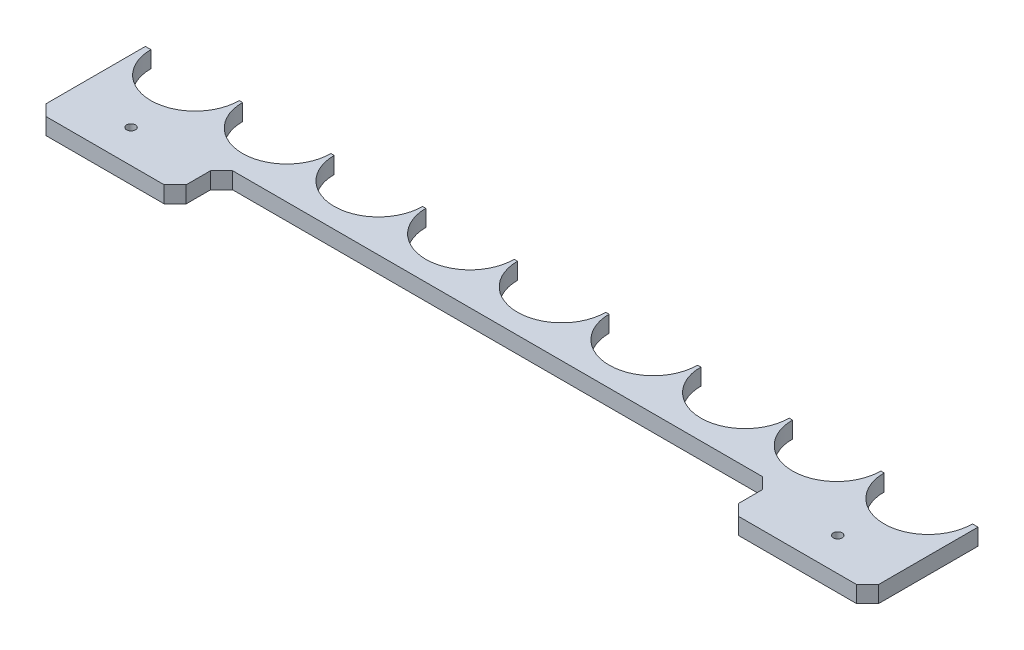
ISO-10303-21;
HEADER;
FILE_DESCRIPTION(('STEP AP214'),'2;1');
FILE_NAME('part.step','',(''),(''),'','','');
FILE_SCHEMA(('AUTOMOTIVE_DESIGN { 1 0 10303 214 1 1 1 1 }'));
ENDSEC;
DATA;
#1=APPLICATION_CONTEXT('core data for automotive mechanical design processes');
#2=APPLICATION_PROTOCOL_DEFINITION('international standard','automotive_design',2000,#1);
#3=PRODUCT_CONTEXT('',#1,'mechanical');
#4=PRODUCT('Part','Part','',(#3));
#5=PRODUCT_RELATED_PRODUCT_CATEGORY('part','',(#4));
#6=PRODUCT_DEFINITION_FORMATION('','',#4);
#7=PRODUCT_DEFINITION_CONTEXT('part definition',#1,'design');
#8=PRODUCT_DEFINITION('design','',#6,#7);
#9=PRODUCT_DEFINITION_SHAPE('','',#8);
#10=(LENGTH_UNIT() NAMED_UNIT(*) SI_UNIT(.MILLI.,.METRE.));
#11=(NAMED_UNIT(*) PLANE_ANGLE_UNIT() SI_UNIT($,.RADIAN.));
#12=(NAMED_UNIT(*) SI_UNIT($,.STERADIAN.) SOLID_ANGLE_UNIT());
#13=UNCERTAINTY_MEASURE_WITH_UNIT(LENGTH_MEASURE(1.E-05),#10,'distance_accuracy_value','');
#14=(GEOMETRIC_REPRESENTATION_CONTEXT(3) GLOBAL_UNCERTAINTY_ASSIGNED_CONTEXT((#13)) GLOBAL_UNIT_ASSIGNED_CONTEXT((#10,
#11,#12)) REPRESENTATION_CONTEXT('',''));
#15=CARTESIAN_POINT('',(0.,0.,0.));
#16=DIRECTION('',(0.,0.,1.));
#17=DIRECTION('',(1.,0.,0.));
#18=AXIS2_PLACEMENT_3D('',#15,#16,#17);
#19=CARTESIAN_POINT('',(-377.,-15.,50.));
#20=DIRECTION('',(0.,0.,1.));
#21=DIRECTION('',(1.,0.,0.));
#22=AXIS2_PLACEMENT_3D('',#19,#20,#21);
#23=PLANE('',#22);
#24=DIRECTION('',(1.,0.,0.));
#25=VECTOR('',#24,1.);
#26=CARTESIAN_POINT('',(-377.,-15.,50.));
#27=LINE('',#26,#25);
#28=CARTESIAN_POINT('',(-367.,-15.,50.));
#29=VERTEX_POINT('',#28);
#30=CARTESIAN_POINT('',(-260.,-15.,50.));
#31=VERTEX_POINT('',#30);
#32=EDGE_CURVE('E270',#29,#31,#27,.T.);
#33=ORIENTED_EDGE('',*,*,#32,.T.);
#34=DIRECTION('',(0.,1.,0.));
#35=VECTOR('',#34,1.);
#36=CARTESIAN_POINT('',(-260.,0.,50.));
#37=LINE('',#36,#35);
#38=CARTESIAN_POINT('',(-260.,0.,50.));
#39=VERTEX_POINT('',#38);
#40=EDGE_CURVE('E476',#31,#39,#37,.T.);
#41=ORIENTED_EDGE('',*,*,#40,.T.);
#42=DIRECTION('',(1.,0.,0.));
#43=VECTOR('',#42,1.);
#44=CARTESIAN_POINT('',(-377.,0.,50.));
#45=LINE('',#44,#43);
#46=CARTESIAN_POINT('',(-367.,0.,50.));
#47=VERTEX_POINT('',#46);
#48=EDGE_CURVE('E262',#47,#39,#45,.T.);
#49=ORIENTED_EDGE('',*,*,#48,.F.);
#50=DIRECTION('',(0.,-1.,0.));
#51=VECTOR('',#50,1.);
#52=CARTESIAN_POINT('',(-367.,-15.,50.));
#53=LINE('',#52,#51);
#54=EDGE_CURVE('E474',#47,#29,#53,.T.);
#55=ORIENTED_EDGE('',*,*,#54,.T.);
#56=EDGE_LOOP('',(#33,#41,#49,#55));
#57=FACE_BOUND('',#56,.T.);
#58=ADVANCED_FACE('F40',(#57),#23,.T.);
#59=CARTESIAN_POINT('',(377.,-15.,-50.));
#60=DIRECTION('',(1.,0.,0.));
#61=DIRECTION('',(0.,0.,-1.));
#62=AXIS2_PLACEMENT_3D('',#59,#60,#61);
#63=PLANE('',#62);
#64=DIRECTION('',(0.,0.,-1.));
#65=VECTOR('',#64,1.);
#66=CARTESIAN_POINT('',(377.,0.,-50.));
#67=LINE('',#66,#65);
#68=CARTESIAN_POINT('',(377.,0.,40.));
#69=VERTEX_POINT('',#68);
#70=CARTESIAN_POINT('',(377.,0.,-50.));
#71=VERTEX_POINT('',#70);
#72=EDGE_CURVE('E338',#69,#71,#67,.T.);
#73=ORIENTED_EDGE('',*,*,#72,.F.);
#74=DIRECTION('',(0.,-1.,0.));
#75=VECTOR('',#74,1.);
#76=CARTESIAN_POINT('',(377.,-15.,40.));
#77=LINE('',#76,#75);
#78=CARTESIAN_POINT('',(377.,-15.,40.));
#79=VERTEX_POINT('',#78);
#80=EDGE_CURVE('E258',#69,#79,#77,.T.);
#81=ORIENTED_EDGE('',*,*,#80,.T.);
#82=DIRECTION('',(0.,0.,-1.));
#83=VECTOR('',#82,1.);
#84=CARTESIAN_POINT('',(377.,-15.,-50.));
#85=LINE('',#84,#83);
#86=CARTESIAN_POINT('',(377.,-15.,-50.));
#87=VERTEX_POINT('',#86);
#88=EDGE_CURVE('E251',#79,#87,#85,.T.);
#89=ORIENTED_EDGE('',*,*,#88,.T.);
#90=DIRECTION('',(0.,1.,0.));
#91=VECTOR('',#90,1.);
#92=CARTESIAN_POINT('',(377.,-15.,-50.));
#93=LINE('',#92,#91);
#94=EDGE_CURVE('E255',#87,#71,#93,.T.);
#95=ORIENTED_EDGE('',*,*,#94,.T.);
#96=EDGE_LOOP('',(#73,#81,#89,#95));
#97=FACE_BOUND('',#96,.T.);
#98=ADVANCED_FACE('F254',(#97),#63,.T.);
#99=CARTESIAN_POINT('',(260.,-15.,50.));
#100=VERTEX_POINT('',#99);
#101=CARTESIAN_POINT('',(367.,-15.,50.));
#102=VERTEX_POINT('',#101);
#103=EDGE_CURVE('E335',#100,#102,#27,.T.);
#104=ORIENTED_EDGE('',*,*,#103,.T.);
#105=DIRECTION('',(0.,1.,0.));
#106=VECTOR('',#105,1.);
#107=CARTESIAN_POINT('',(367.,-15.,50.));
#108=LINE('',#107,#106);
#109=CARTESIAN_POINT('',(367.,0.,50.));
#110=VERTEX_POINT('',#109);
#111=EDGE_CURVE('E441',#102,#110,#108,.T.);
#112=ORIENTED_EDGE('',*,*,#111,.T.);
#113=CARTESIAN_POINT('',(260.,0.,50.));
#114=VERTEX_POINT('',#113);
#115=EDGE_CURVE('E399',#114,#110,#45,.T.);
#116=ORIENTED_EDGE('',*,*,#115,.F.);
#117=DIRECTION('',(0.,-1.,0.));
#118=VECTOR('',#117,1.);
#119=CARTESIAN_POINT('',(260.,-15.,50.));
#120=LINE('',#119,#118);
#121=EDGE_CURVE('E404',#114,#100,#120,.T.);
#122=ORIENTED_EDGE('',*,*,#121,.T.);
#123=EDGE_LOOP('',(#104,#112,#116,#122));
#124=FACE_BOUND('',#123,.T.);
#125=ADVANCED_FACE('F549',(#124),#23,.T.);
#126=CARTESIAN_POINT('',(-377.,-15.,-50.));
#127=DIRECTION('',(-1.,0.,0.));
#128=DIRECTION('',(0.,0.,1.));
#129=AXIS2_PLACEMENT_3D('',#126,#127,#128);
#130=PLANE('',#129);
#131=DIRECTION('',(0.,0.,1.));
#132=VECTOR('',#131,1.);
#133=CARTESIAN_POINT('',(-377.,-15.,-50.));
#134=LINE('',#133,#132);
#135=CARTESIAN_POINT('',(-377.,-15.,-50.));
#136=VERTEX_POINT('',#135);
#137=CARTESIAN_POINT('',(-377.,-15.,40.));
#138=VERTEX_POINT('',#137);
#139=EDGE_CURVE('E332',#136,#138,#134,.T.);
#140=ORIENTED_EDGE('',*,*,#139,.T.);
#141=DIRECTION('',(0.,1.,0.));
#142=VECTOR('',#141,1.);
#143=CARTESIAN_POINT('',(-377.,-15.,40.));
#144=LINE('',#143,#142);
#145=CARTESIAN_POINT('',(-377.,0.,40.));
#146=VERTEX_POINT('',#145);
#147=EDGE_CURVE('E479',#138,#146,#144,.T.);
#148=ORIENTED_EDGE('',*,*,#147,.T.);
#149=DIRECTION('',(0.,0.,1.));
#150=VECTOR('',#149,1.);
#151=CARTESIAN_POINT('',(-377.,0.,-50.));
#152=LINE('',#151,#150);
#153=CARTESIAN_POINT('',(-377.,0.,-50.));
#154=VERTEX_POINT('',#153);
#155=EDGE_CURVE('E396',#154,#146,#152,.T.);
#156=ORIENTED_EDGE('',*,*,#155,.F.);
#157=DIRECTION('',(0.,1.,0.));
#158=VECTOR('',#157,1.);
#159=CARTESIAN_POINT('',(-377.,-15.,-50.));
#160=LINE('',#159,#158);
#161=EDGE_CURVE('E402',#136,#154,#160,.T.);
#162=ORIENTED_EDGE('',*,*,#161,.F.);
#163=EDGE_LOOP('',(#140,#148,#156,#162));
#164=FACE_BOUND('',#163,.T.);
#165=ADVANCED_FACE('F556',(#164),#130,.T.);
#166=CARTESIAN_POINT('',(-377.,-15.,-50.));
#167=DIRECTION('',(0.,0.,-1.));
#168=DIRECTION('',(-1.,0.,0.));
#169=AXIS2_PLACEMENT_3D('',#166,#167,#168);
#170=PLANE('',#169);
#171=DIRECTION('',(-1.,0.,0.));
#172=VECTOR('',#171,1.);
#173=CARTESIAN_POINT('',(-377.,0.,-50.));
#174=LINE('',#173,#172);
#175=CARTESIAN_POINT('',(-372.,0.,-50.));
#176=VERTEX_POINT('',#175);
#177=EDGE_CURVE('E393',#176,#154,#174,.T.);
#178=ORIENTED_EDGE('',*,*,#177,.F.);
#179=DIRECTION('',(0.,1.,0.));
#180=VECTOR('',#179,1.);
#181=CARTESIAN_POINT('',(-372.,-15.,-50.));
#182=LINE('',#181,#180);
#183=CARTESIAN_POINT('',(-372.,-15.,-50.));
#184=VERTEX_POINT('',#183);
#185=EDGE_CURVE('E405',#184,#176,#182,.T.);
#186=ORIENTED_EDGE('',*,*,#185,.F.);
#187=DIRECTION('',(-1.,0.,0.));
#188=VECTOR('',#187,1.);
#189=CARTESIAN_POINT('',(-377.,-15.,-50.));
#190=LINE('',#189,#188);
#191=EDGE_CURVE('E329',#184,#136,#190,.T.);
#192=ORIENTED_EDGE('',*,*,#191,.T.);
#193=ORIENTED_EDGE('',*,*,#161,.T.);
#194=EDGE_LOOP('',(#178,#186,#192,#193));
#195=FACE_BOUND('',#194,.T.);
#196=ADVANCED_FACE('F561',(#195),#170,.T.);
#197=CARTESIAN_POINT('',(-332.,-15.,-50.));
#198=DIRECTION('',(0.,1.,0.));
#199=DIRECTION('',(0.,0.,1.));
#200=AXIS2_PLACEMENT_3D('',#197,#198,#199);
#201=CYLINDRICAL_SURFACE('',#200,40.);
#202=CARTESIAN_POINT('',(-332.,0.,-50.));
#203=DIRECTION('',(0.,-1.,0.));
#204=DIRECTION('',(0.,0.,1.));
#205=AXIS2_PLACEMENT_3D('',#202,#203,#204);
#206=CIRCLE('',#205,40.);
#207=CARTESIAN_POINT('',(-292.,0.,-50.));
#208=VERTEX_POINT('',#207);
#209=EDGE_CURVE('E390',#208,#176,#206,.T.);
#210=ORIENTED_EDGE('',*,*,#209,.F.);
#211=DIRECTION('',(0.,1.,0.));
#212=VECTOR('',#211,1.);
#213=CARTESIAN_POINT('',(-292.,-15.,-50.));
#214=LINE('',#213,#212);
#215=CARTESIAN_POINT('',(-292.,-15.,-50.));
#216=VERTEX_POINT('',#215);
#217=EDGE_CURVE('E407',#216,#208,#214,.T.);
#218=ORIENTED_EDGE('',*,*,#217,.F.);
#219=CARTESIAN_POINT('',(-332.,-15.,-50.));
#220=DIRECTION('',(0.,-1.,0.));
#221=DIRECTION('',(0.,0.,1.));
#222=AXIS2_PLACEMENT_3D('',#219,#220,#221);
#223=CIRCLE('',#222,40.);
#224=EDGE_CURVE('E326',#216,#184,#223,.T.);
#225=ORIENTED_EDGE('',*,*,#224,.T.);
#226=ORIENTED_EDGE('',*,*,#185,.T.);
#227=EDGE_LOOP('',(#210,#218,#225,#226));
#228=FACE_BOUND('',#227,.T.);
#229=ADVANCED_FACE('F618',(#228),#201,.F.);
#230=CARTESIAN_POINT('',(-292.,-15.,-50.));
#231=DIRECTION('',(0.,0.,-1.));
#232=DIRECTION('',(-1.,0.,0.));
#233=AXIS2_PLACEMENT_3D('',#230,#231,#232);
#234=PLANE('',#233);
#235=DIRECTION('',(-1.,0.,0.));
#236=VECTOR('',#235,1.);
#237=CARTESIAN_POINT('',(-292.,0.,-50.));
#238=LINE('',#237,#236);
#239=CARTESIAN_POINT('',(-289.,0.,-50.));
#240=VERTEX_POINT('',#239);
#241=EDGE_CURVE('E387',#240,#208,#238,.T.);
#242=ORIENTED_EDGE('',*,*,#241,.F.);
#243=DIRECTION('',(0.,1.,0.));
#244=VECTOR('',#243,1.);
#245=CARTESIAN_POINT('',(-289.,-15.,-50.));
#246=LINE('',#245,#244);
#247=CARTESIAN_POINT('',(-289.,-15.,-50.));
#248=VERTEX_POINT('',#247);
#249=EDGE_CURVE('E409',#248,#240,#246,.T.);
#250=ORIENTED_EDGE('',*,*,#249,.F.);
#251=DIRECTION('',(-1.,0.,0.));
#252=VECTOR('',#251,1.);
#253=CARTESIAN_POINT('',(-292.,-15.,-50.));
#254=LINE('',#253,#252);
#255=EDGE_CURVE('E323',#248,#216,#254,.T.);
#256=ORIENTED_EDGE('',*,*,#255,.T.);
#257=ORIENTED_EDGE('',*,*,#217,.T.);
#258=EDGE_LOOP('',(#242,#250,#256,#257));
#259=FACE_BOUND('',#258,.T.);
#260=ADVANCED_FACE('F621',(#259),#234,.T.);
#261=CARTESIAN_POINT('',(-249.,-15.,-50.));
#262=DIRECTION('',(0.,1.,0.));
#263=DIRECTION('',(0.,0.,1.));
#264=AXIS2_PLACEMENT_3D('',#261,#262,#263);
#265=CYLINDRICAL_SURFACE('',#264,40.);
#266=CARTESIAN_POINT('',(-249.,0.,-50.));
#267=DIRECTION('',(0.,-1.,0.));
#268=DIRECTION('',(0.,0.,1.));
#269=AXIS2_PLACEMENT_3D('',#266,#267,#268);
#270=CIRCLE('',#269,40.);
#271=CARTESIAN_POINT('',(-209.,0.,-50.));
#272=VERTEX_POINT('',#271);
#273=EDGE_CURVE('E384',#272,#240,#270,.T.);
#274=ORIENTED_EDGE('',*,*,#273,.F.);
#275=DIRECTION('',(0.,1.,0.));
#276=VECTOR('',#275,1.);
#277=CARTESIAN_POINT('',(-209.,-15.,-50.));
#278=LINE('',#277,#276);
#279=CARTESIAN_POINT('',(-209.,-15.,-50.));
#280=VERTEX_POINT('',#279);
#281=EDGE_CURVE('E411',#280,#272,#278,.T.);
#282=ORIENTED_EDGE('',*,*,#281,.F.);
#283=CARTESIAN_POINT('',(-249.,-15.,-50.));
#284=DIRECTION('',(0.,-1.,0.));
#285=DIRECTION('',(0.,0.,1.));
#286=AXIS2_PLACEMENT_3D('',#283,#284,#285);
#287=CIRCLE('',#286,40.);
#288=EDGE_CURVE('E320',#280,#248,#287,.T.);
#289=ORIENTED_EDGE('',*,*,#288,.T.);
#290=ORIENTED_EDGE('',*,*,#249,.T.);
#291=EDGE_LOOP('',(#274,#282,#289,#290));
#292=FACE_BOUND('',#291,.T.);
#293=ADVANCED_FACE('F626',(#292),#265,.F.);
#294=CARTESIAN_POINT('',(-209.,-15.,-50.));
#295=DIRECTION('',(0.,0.,-1.));
#296=DIRECTION('',(-1.,0.,0.));
#297=AXIS2_PLACEMENT_3D('',#294,#295,#296);
#298=PLANE('',#297);
#299=DIRECTION('',(-1.,0.,0.));
#300=VECTOR('',#299,1.);
#301=CARTESIAN_POINT('',(-209.,0.,-50.));
#302=LINE('',#301,#300);
#303=CARTESIAN_POINT('',(-206.,0.,-50.));
#304=VERTEX_POINT('',#303);
#305=EDGE_CURVE('E381',#304,#272,#302,.T.);
#306=ORIENTED_EDGE('',*,*,#305,.F.);
#307=DIRECTION('',(0.,1.,0.));
#308=VECTOR('',#307,1.);
#309=CARTESIAN_POINT('',(-206.,-15.,-50.));
#310=LINE('',#309,#308);
#311=CARTESIAN_POINT('',(-206.,-15.,-50.));
#312=VERTEX_POINT('',#311);
#313=EDGE_CURVE('E413',#312,#304,#310,.T.);
#314=ORIENTED_EDGE('',*,*,#313,.F.);
#315=DIRECTION('',(-1.,0.,0.));
#316=VECTOR('',#315,1.);
#317=CARTESIAN_POINT('',(-209.,-15.,-50.));
#318=LINE('',#317,#316);
#319=EDGE_CURVE('E317',#312,#280,#318,.T.);
#320=ORIENTED_EDGE('',*,*,#319,.T.);
#321=ORIENTED_EDGE('',*,*,#281,.T.);
#322=EDGE_LOOP('',(#306,#314,#320,#321));
#323=FACE_BOUND('',#322,.T.);
#324=ADVANCED_FACE('F629',(#323),#298,.T.);
#325=CARTESIAN_POINT('',(-166.,-15.,-50.));
#326=DIRECTION('',(0.,1.,0.));
#327=DIRECTION('',(0.,0.,1.));
#328=AXIS2_PLACEMENT_3D('',#325,#326,#327);
#329=CYLINDRICAL_SURFACE('',#328,40.);
#330=CARTESIAN_POINT('',(-166.,0.,-50.));
#331=DIRECTION('',(0.,-1.,0.));
#332=DIRECTION('',(0.,0.,1.));
#333=AXIS2_PLACEMENT_3D('',#330,#331,#332);
#334=CIRCLE('',#333,40.);
#335=CARTESIAN_POINT('',(-126.,0.,-50.));
#336=VERTEX_POINT('',#335);
#337=EDGE_CURVE('E378',#336,#304,#334,.T.);
#338=ORIENTED_EDGE('',*,*,#337,.F.);
#339=DIRECTION('',(0.,1.,0.));
#340=VECTOR('',#339,1.);
#341=CARTESIAN_POINT('',(-126.,-15.,-50.));
#342=LINE('',#341,#340);
#343=CARTESIAN_POINT('',(-126.,-15.,-50.));
#344=VERTEX_POINT('',#343);
#345=EDGE_CURVE('E415',#344,#336,#342,.T.);
#346=ORIENTED_EDGE('',*,*,#345,.F.);
#347=CARTESIAN_POINT('',(-166.,-15.,-50.));
#348=DIRECTION('',(0.,-1.,0.));
#349=DIRECTION('',(0.,0.,1.));
#350=AXIS2_PLACEMENT_3D('',#347,#348,#349);
#351=CIRCLE('',#350,40.);
#352=EDGE_CURVE('E314',#344,#312,#351,.T.);
#353=ORIENTED_EDGE('',*,*,#352,.T.);
#354=ORIENTED_EDGE('',*,*,#313,.T.);
#355=EDGE_LOOP('',(#338,#346,#353,#354));
#356=FACE_BOUND('',#355,.T.);
#357=ADVANCED_FACE('F634',(#356),#329,.F.);
#358=CARTESIAN_POINT('',(-126.,-15.,-50.));
#359=DIRECTION('',(0.,0.,-1.));
#360=DIRECTION('',(-1.,0.,0.));
#361=AXIS2_PLACEMENT_3D('',#358,#359,#360);
#362=PLANE('',#361);
#363=DIRECTION('',(-1.,0.,0.));
#364=VECTOR('',#363,1.);
#365=CARTESIAN_POINT('',(-126.,0.,-50.));
#366=LINE('',#365,#364);
#367=CARTESIAN_POINT('',(-123.,0.,-50.));
#368=VERTEX_POINT('',#367);
#369=EDGE_CURVE('E375',#368,#336,#366,.T.);
#370=ORIENTED_EDGE('',*,*,#369,.F.);
#371=DIRECTION('',(0.,1.,0.));
#372=VECTOR('',#371,1.);
#373=CARTESIAN_POINT('',(-123.,-15.,-50.));
#374=LINE('',#373,#372);
#375=CARTESIAN_POINT('',(-123.,-15.,-50.));
#376=VERTEX_POINT('',#375);
#377=EDGE_CURVE('E417',#376,#368,#374,.T.);
#378=ORIENTED_EDGE('',*,*,#377,.F.);
#379=DIRECTION('',(-1.,0.,0.));
#380=VECTOR('',#379,1.);
#381=CARTESIAN_POINT('',(-126.,-15.,-50.));
#382=LINE('',#381,#380);
#383=EDGE_CURVE('E311',#376,#344,#382,.T.);
#384=ORIENTED_EDGE('',*,*,#383,.T.);
#385=ORIENTED_EDGE('',*,*,#345,.T.);
#386=EDGE_LOOP('',(#370,#378,#384,#385));
#387=FACE_BOUND('',#386,.T.);
#388=ADVANCED_FACE('F637',(#387),#362,.T.);
#389=CARTESIAN_POINT('',(-83.0000000000001,-15.,-50.));
#390=DIRECTION('',(0.,1.,0.));
#391=DIRECTION('',(0.,0.,1.));
#392=AXIS2_PLACEMENT_3D('',#389,#390,#391);
#393=CYLINDRICAL_SURFACE('',#392,40.);
#394=CARTESIAN_POINT('',(-83.0000000000001,0.,-50.));
#395=DIRECTION('',(0.,-1.,0.));
#396=DIRECTION('',(0.,0.,1.));
#397=AXIS2_PLACEMENT_3D('',#394,#395,#396);
#398=CIRCLE('',#397,40.);
#399=CARTESIAN_POINT('',(-43.0000000000001,0.,-50.));
#400=VERTEX_POINT('',#399);
#401=EDGE_CURVE('E372',#400,#368,#398,.T.);
#402=ORIENTED_EDGE('',*,*,#401,.F.);
#403=DIRECTION('',(0.,1.,0.));
#404=VECTOR('',#403,1.);
#405=CARTESIAN_POINT('',(-43.0000000000001,-15.,-50.));
#406=LINE('',#405,#404);
#407=CARTESIAN_POINT('',(-43.0000000000001,-15.,-50.));
#408=VERTEX_POINT('',#407);
#409=EDGE_CURVE('E419',#408,#400,#406,.T.);
#410=ORIENTED_EDGE('',*,*,#409,.F.);
#411=CARTESIAN_POINT('',(-83.0000000000001,-15.,-50.));
#412=DIRECTION('',(0.,-1.,0.));
#413=DIRECTION('',(0.,0.,1.));
#414=AXIS2_PLACEMENT_3D('',#411,#412,#413);
#415=CIRCLE('',#414,40.);
#416=EDGE_CURVE('E308',#408,#376,#415,.T.);
#417=ORIENTED_EDGE('',*,*,#416,.T.);
#418=ORIENTED_EDGE('',*,*,#377,.T.);
#419=EDGE_LOOP('',(#402,#410,#417,#418));
#420=FACE_BOUND('',#419,.T.);
#421=ADVANCED_FACE('F642',(#420),#393,.F.);
#422=CARTESIAN_POINT('',(-43.0000000000001,-15.,-50.));
#423=DIRECTION('',(0.,0.,-1.));
#424=DIRECTION('',(-1.,0.,0.));
#425=AXIS2_PLACEMENT_3D('',#422,#423,#424);
#426=PLANE('',#425);
#427=DIRECTION('',(-1.,0.,0.));
#428=VECTOR('',#427,1.);
#429=CARTESIAN_POINT('',(-43.0000000000001,0.,-50.));
#430=LINE('',#429,#428);
#431=CARTESIAN_POINT('',(-40.0000000000001,0.,-50.));
#432=VERTEX_POINT('',#431);
#433=EDGE_CURVE('E369',#432,#400,#430,.T.);
#434=ORIENTED_EDGE('',*,*,#433,.F.);
#435=DIRECTION('',(0.,1.,0.));
#436=VECTOR('',#435,1.);
#437=CARTESIAN_POINT('',(-40.0000000000001,-15.,-50.));
#438=LINE('',#437,#436);
#439=CARTESIAN_POINT('',(-40.0000000000001,-15.,-50.));
#440=VERTEX_POINT('',#439);
#441=EDGE_CURVE('E421',#440,#432,#438,.T.);
#442=ORIENTED_EDGE('',*,*,#441,.F.);
#443=DIRECTION('',(-1.,0.,0.));
#444=VECTOR('',#443,1.);
#445=CARTESIAN_POINT('',(-43.0000000000001,-15.,-50.));
#446=LINE('',#445,#444);
#447=EDGE_CURVE('E305',#440,#408,#446,.T.);
#448=ORIENTED_EDGE('',*,*,#447,.T.);
#449=ORIENTED_EDGE('',*,*,#409,.T.);
#450=EDGE_LOOP('',(#434,#442,#448,#449));
#451=FACE_BOUND('',#450,.T.);
#452=ADVANCED_FACE('F645',(#451),#426,.T.);
#453=CARTESIAN_POINT('',(0.,-15.,-50.));
#454=DIRECTION('',(0.,1.,0.));
#455=DIRECTION('',(0.,0.,1.));
#456=AXIS2_PLACEMENT_3D('',#453,#454,#455);
#457=CYLINDRICAL_SURFACE('',#456,40.);
#458=CARTESIAN_POINT('',(0.,0.,-50.));
#459=DIRECTION('',(0.,-1.,0.));
#460=DIRECTION('',(0.,0.,1.));
#461=AXIS2_PLACEMENT_3D('',#458,#459,#460);
#462=CIRCLE('',#461,40.);
#463=CARTESIAN_POINT('',(39.9999999999999,0.,-50.));
#464=VERTEX_POINT('',#463);
#465=EDGE_CURVE('E366',#464,#432,#462,.T.);
#466=ORIENTED_EDGE('',*,*,#465,.F.);
#467=DIRECTION('',(0.,1.,0.));
#468=VECTOR('',#467,1.);
#469=CARTESIAN_POINT('',(39.9999999999999,-15.,-50.));
#470=LINE('',#469,#468);
#471=CARTESIAN_POINT('',(39.9999999999999,-15.,-50.));
#472=VERTEX_POINT('',#471);
#473=EDGE_CURVE('E423',#472,#464,#470,.T.);
#474=ORIENTED_EDGE('',*,*,#473,.F.);
#475=CARTESIAN_POINT('',(0.,-15.,-50.));
#476=DIRECTION('',(0.,-1.,0.));
#477=DIRECTION('',(0.,0.,1.));
#478=AXIS2_PLACEMENT_3D('',#475,#476,#477);
#479=CIRCLE('',#478,40.);
#480=EDGE_CURVE('E302',#472,#440,#479,.T.);
#481=ORIENTED_EDGE('',*,*,#480,.T.);
#482=ORIENTED_EDGE('',*,*,#441,.T.);
#483=EDGE_LOOP('',(#466,#474,#481,#482));
#484=FACE_BOUND('',#483,.T.);
#485=ADVANCED_FACE('F650',(#484),#457,.F.);
#486=CARTESIAN_POINT('',(39.9999999999999,-15.,-50.));
#487=DIRECTION('',(0.,0.,-1.));
#488=DIRECTION('',(-1.,0.,0.));
#489=AXIS2_PLACEMENT_3D('',#486,#487,#488);
#490=PLANE('',#489);
#491=DIRECTION('',(-1.,0.,0.));
#492=VECTOR('',#491,1.);
#493=CARTESIAN_POINT('',(39.9999999999999,0.,-50.));
#494=LINE('',#493,#492);
#495=CARTESIAN_POINT('',(43.,0.,-50.));
#496=VERTEX_POINT('',#495);
#497=EDGE_CURVE('E363',#496,#464,#494,.T.);
#498=ORIENTED_EDGE('',*,*,#497,.F.);
#499=DIRECTION('',(0.,1.,0.));
#500=VECTOR('',#499,1.);
#501=CARTESIAN_POINT('',(43.,-15.,-50.));
#502=LINE('',#501,#500);
#503=CARTESIAN_POINT('',(43.,-15.,-50.));
#504=VERTEX_POINT('',#503);
#505=EDGE_CURVE('E425',#504,#496,#502,.T.);
#506=ORIENTED_EDGE('',*,*,#505,.F.);
#507=DIRECTION('',(-1.,0.,0.));
#508=VECTOR('',#507,1.);
#509=CARTESIAN_POINT('',(39.9999999999999,-15.,-50.));
#510=LINE('',#509,#508);
#511=EDGE_CURVE('E299',#504,#472,#510,.T.);
#512=ORIENTED_EDGE('',*,*,#511,.T.);
#513=ORIENTED_EDGE('',*,*,#473,.T.);
#514=EDGE_LOOP('',(#498,#506,#512,#513));
#515=FACE_BOUND('',#514,.T.);
#516=ADVANCED_FACE('F653',(#515),#490,.T.);
#517=CARTESIAN_POINT('',(83.,-15.,-50.));
#518=DIRECTION('',(0.,1.,0.));
#519=DIRECTION('',(0.,0.,1.));
#520=AXIS2_PLACEMENT_3D('',#517,#518,#519);
#521=CYLINDRICAL_SURFACE('',#520,40.);
#522=CARTESIAN_POINT('',(83.,0.,-50.));
#523=DIRECTION('',(0.,-1.,0.));
#524=DIRECTION('',(0.,0.,1.));
#525=AXIS2_PLACEMENT_3D('',#522,#523,#524);
#526=CIRCLE('',#525,40.);
#527=CARTESIAN_POINT('',(123.,0.,-50.));
#528=VERTEX_POINT('',#527);
#529=EDGE_CURVE('E360',#528,#496,#526,.T.);
#530=ORIENTED_EDGE('',*,*,#529,.F.);
#531=DIRECTION('',(0.,1.,0.));
#532=VECTOR('',#531,1.);
#533=CARTESIAN_POINT('',(123.,-15.,-50.));
#534=LINE('',#533,#532);
#535=CARTESIAN_POINT('',(123.,-15.,-50.));
#536=VERTEX_POINT('',#535);
#537=EDGE_CURVE('E427',#536,#528,#534,.T.);
#538=ORIENTED_EDGE('',*,*,#537,.F.);
#539=CARTESIAN_POINT('',(83.,-15.,-50.));
#540=DIRECTION('',(0.,-1.,0.));
#541=DIRECTION('',(0.,0.,1.));
#542=AXIS2_PLACEMENT_3D('',#539,#540,#541);
#543=CIRCLE('',#542,40.);
#544=EDGE_CURVE('E296',#536,#504,#543,.T.);
#545=ORIENTED_EDGE('',*,*,#544,.T.);
#546=ORIENTED_EDGE('',*,*,#505,.T.);
#547=EDGE_LOOP('',(#530,#538,#545,#546));
#548=FACE_BOUND('',#547,.T.);
#549=ADVANCED_FACE('F658',(#548),#521,.F.);
#550=CARTESIAN_POINT('',(123.,-15.,-50.));
#551=DIRECTION('',(0.,0.,-1.));
#552=DIRECTION('',(-1.,0.,0.));
#553=AXIS2_PLACEMENT_3D('',#550,#551,#552);
#554=PLANE('',#553);
#555=DIRECTION('',(-1.,0.,0.));
#556=VECTOR('',#555,1.);
#557=CARTESIAN_POINT('',(123.,0.,-50.));
#558=LINE('',#557,#556);
#559=CARTESIAN_POINT('',(126.,0.,-50.));
#560=VERTEX_POINT('',#559);
#561=EDGE_CURVE('E357',#560,#528,#558,.T.);
#562=ORIENTED_EDGE('',*,*,#561,.F.);
#563=DIRECTION('',(0.,1.,0.));
#564=VECTOR('',#563,1.);
#565=CARTESIAN_POINT('',(126.,-15.,-50.));
#566=LINE('',#565,#564);
#567=CARTESIAN_POINT('',(126.,-15.,-50.));
#568=VERTEX_POINT('',#567);
#569=EDGE_CURVE('E429',#568,#560,#566,.T.);
#570=ORIENTED_EDGE('',*,*,#569,.F.);
#571=DIRECTION('',(-1.,0.,0.));
#572=VECTOR('',#571,1.);
#573=CARTESIAN_POINT('',(123.,-15.,-50.));
#574=LINE('',#573,#572);
#575=EDGE_CURVE('E293',#568,#536,#574,.T.);
#576=ORIENTED_EDGE('',*,*,#575,.T.);
#577=ORIENTED_EDGE('',*,*,#537,.T.);
#578=EDGE_LOOP('',(#562,#570,#576,#577));
#579=FACE_BOUND('',#578,.T.);
#580=ADVANCED_FACE('F661',(#579),#554,.T.);
#581=CARTESIAN_POINT('',(166.,-15.,-50.));
#582=DIRECTION('',(0.,1.,0.));
#583=DIRECTION('',(0.,0.,1.));
#584=AXIS2_PLACEMENT_3D('',#581,#582,#583);
#585=CYLINDRICAL_SURFACE('',#584,40.);
#586=CARTESIAN_POINT('',(166.,0.,-50.));
#587=DIRECTION('',(0.,-1.,0.));
#588=DIRECTION('',(0.,0.,1.));
#589=AXIS2_PLACEMENT_3D('',#586,#587,#588);
#590=CIRCLE('',#589,40.);
#591=CARTESIAN_POINT('',(206.,0.,-50.));
#592=VERTEX_POINT('',#591);
#593=EDGE_CURVE('E354',#592,#560,#590,.T.);
#594=ORIENTED_EDGE('',*,*,#593,.F.);
#595=DIRECTION('',(0.,1.,0.));
#596=VECTOR('',#595,1.);
#597=CARTESIAN_POINT('',(206.,-15.,-50.));
#598=LINE('',#597,#596);
#599=CARTESIAN_POINT('',(206.,-15.,-50.));
#600=VERTEX_POINT('',#599);
#601=EDGE_CURVE('E431',#600,#592,#598,.T.);
#602=ORIENTED_EDGE('',*,*,#601,.F.);
#603=CARTESIAN_POINT('',(166.,-15.,-50.));
#604=DIRECTION('',(0.,-1.,0.));
#605=DIRECTION('',(0.,0.,1.));
#606=AXIS2_PLACEMENT_3D('',#603,#604,#605);
#607=CIRCLE('',#606,40.);
#608=EDGE_CURVE('E290',#600,#568,#607,.T.);
#609=ORIENTED_EDGE('',*,*,#608,.T.);
#610=ORIENTED_EDGE('',*,*,#569,.T.);
#611=EDGE_LOOP('',(#594,#602,#609,#610));
#612=FACE_BOUND('',#611,.T.);
#613=ADVANCED_FACE('F666',(#612),#585,.F.);
#614=CARTESIAN_POINT('',(206.,-15.,-50.));
#615=DIRECTION('',(0.,0.,-1.));
#616=DIRECTION('',(-1.,0.,0.));
#617=AXIS2_PLACEMENT_3D('',#614,#615,#616);
#618=PLANE('',#617);
#619=DIRECTION('',(-1.,0.,0.));
#620=VECTOR('',#619,1.);
#621=CARTESIAN_POINT('',(206.,0.,-50.));
#622=LINE('',#621,#620);
#623=CARTESIAN_POINT('',(209.,0.,-50.));
#624=VERTEX_POINT('',#623);
#625=EDGE_CURVE('E351',#624,#592,#622,.T.);
#626=ORIENTED_EDGE('',*,*,#625,.F.);
#627=DIRECTION('',(0.,1.,0.));
#628=VECTOR('',#627,1.);
#629=CARTESIAN_POINT('',(209.,-15.,-50.));
#630=LINE('',#629,#628);
#631=CARTESIAN_POINT('',(209.,-15.,-50.));
#632=VERTEX_POINT('',#631);
#633=EDGE_CURVE('E433',#632,#624,#630,.T.);
#634=ORIENTED_EDGE('',*,*,#633,.F.);
#635=DIRECTION('',(-1.,0.,0.));
#636=VECTOR('',#635,1.);
#637=CARTESIAN_POINT('',(206.,-15.,-50.));
#638=LINE('',#637,#636);
#639=EDGE_CURVE('E287',#632,#600,#638,.T.);
#640=ORIENTED_EDGE('',*,*,#639,.T.);
#641=ORIENTED_EDGE('',*,*,#601,.T.);
#642=EDGE_LOOP('',(#626,#634,#640,#641));
#643=FACE_BOUND('',#642,.T.);
#644=ADVANCED_FACE('F669',(#643),#618,.T.);
#645=CARTESIAN_POINT('',(249.,-15.,-50.));
#646=DIRECTION('',(0.,1.,0.));
#647=DIRECTION('',(0.,0.,1.));
#648=AXIS2_PLACEMENT_3D('',#645,#646,#647);
#649=CYLINDRICAL_SURFACE('',#648,40.);
#650=CARTESIAN_POINT('',(249.,0.,-50.));
#651=DIRECTION('',(0.,-1.,0.));
#652=DIRECTION('',(0.,0.,1.));
#653=AXIS2_PLACEMENT_3D('',#650,#651,#652);
#654=CIRCLE('',#653,40.);
#655=CARTESIAN_POINT('',(289.,0.,-50.));
#656=VERTEX_POINT('',#655);
#657=EDGE_CURVE('E348',#656,#624,#654,.T.);
#658=ORIENTED_EDGE('',*,*,#657,.F.);
#659=DIRECTION('',(0.,1.,0.));
#660=VECTOR('',#659,1.);
#661=CARTESIAN_POINT('',(289.,-15.,-50.));
#662=LINE('',#661,#660);
#663=CARTESIAN_POINT('',(289.,-15.,-50.));
#664=VERTEX_POINT('',#663);
#665=EDGE_CURVE('E435',#664,#656,#662,.T.);
#666=ORIENTED_EDGE('',*,*,#665,.F.);
#667=CARTESIAN_POINT('',(249.,-15.,-50.));
#668=DIRECTION('',(0.,-1.,0.));
#669=DIRECTION('',(0.,0.,1.));
#670=AXIS2_PLACEMENT_3D('',#667,#668,#669);
#671=CIRCLE('',#670,40.);
#672=EDGE_CURVE('E284',#664,#632,#671,.T.);
#673=ORIENTED_EDGE('',*,*,#672,.T.);
#674=ORIENTED_EDGE('',*,*,#633,.T.);
#675=EDGE_LOOP('',(#658,#666,#673,#674));
#676=FACE_BOUND('',#675,.T.);
#677=ADVANCED_FACE('F673',(#676),#649,.F.);
#678=CARTESIAN_POINT('',(289.,-15.,-50.));
#679=DIRECTION('',(0.,0.,-1.));
#680=DIRECTION('',(-1.,0.,0.));
#681=AXIS2_PLACEMENT_3D('',#678,#679,#680);
#682=PLANE('',#681);
#683=DIRECTION('',(-1.,0.,0.));
#684=VECTOR('',#683,1.);
#685=CARTESIAN_POINT('',(289.,0.,-50.));
#686=LINE('',#685,#684);
#687=CARTESIAN_POINT('',(292.,0.,-50.));
#688=VERTEX_POINT('',#687);
#689=EDGE_CURVE('E345',#688,#656,#686,.T.);
#690=ORIENTED_EDGE('',*,*,#689,.F.);
#691=DIRECTION('',(0.,1.,0.));
#692=VECTOR('',#691,1.);
#693=CARTESIAN_POINT('',(292.,-15.,-50.));
#694=LINE('',#693,#692);
#695=CARTESIAN_POINT('',(292.,-15.,-50.));
#696=VERTEX_POINT('',#695);
#697=EDGE_CURVE('E437',#696,#688,#694,.T.);
#698=ORIENTED_EDGE('',*,*,#697,.F.);
#699=DIRECTION('',(-1.,0.,0.));
#700=VECTOR('',#699,1.);
#701=CARTESIAN_POINT('',(289.,-15.,-50.));
#702=LINE('',#701,#700);
#703=EDGE_CURVE('E278',#696,#664,#702,.T.);
#704=ORIENTED_EDGE('',*,*,#703,.T.);
#705=ORIENTED_EDGE('',*,*,#665,.T.);
#706=EDGE_LOOP('',(#690,#698,#704,#705));
#707=FACE_BOUND('',#706,.T.);
#708=ADVANCED_FACE('F676',(#707),#682,.T.);
#709=CARTESIAN_POINT('',(332.,-15.,-50.));
#710=DIRECTION('',(0.,1.,0.));
#711=DIRECTION('',(0.,0.,1.));
#712=AXIS2_PLACEMENT_3D('',#709,#710,#711);
#713=CYLINDRICAL_SURFACE('',#712,40.);
#714=CARTESIAN_POINT('',(332.,0.,-50.));
#715=DIRECTION('',(0.,-1.,0.));
#716=DIRECTION('',(0.,0.,1.));
#717=AXIS2_PLACEMENT_3D('',#714,#715,#716);
#718=CIRCLE('',#717,40.);
#719=CARTESIAN_POINT('',(372.,0.,-50.));
#720=VERTEX_POINT('',#719);
#721=EDGE_CURVE('E342',#720,#688,#718,.T.);
#722=ORIENTED_EDGE('',*,*,#721,.F.);
#723=DIRECTION('',(0.,1.,0.));
#724=VECTOR('',#723,1.);
#725=CARTESIAN_POINT('',(372.,-15.,-50.));
#726=LINE('',#725,#724);
#727=CARTESIAN_POINT('',(372.,-15.,-50.));
#728=VERTEX_POINT('',#727);
#729=EDGE_CURVE('E269',#728,#720,#726,.T.);
#730=ORIENTED_EDGE('',*,*,#729,.F.);
#731=CARTESIAN_POINT('',(332.,-15.,-50.));
#732=DIRECTION('',(0.,-1.,0.));
#733=DIRECTION('',(0.,0.,1.));
#734=AXIS2_PLACEMENT_3D('',#731,#732,#733);
#735=CIRCLE('',#734,40.);
#736=EDGE_CURVE('E276',#728,#696,#735,.T.);
#737=ORIENTED_EDGE('',*,*,#736,.T.);
#738=ORIENTED_EDGE('',*,*,#697,.T.);
#739=EDGE_LOOP('',(#722,#730,#737,#738));
#740=FACE_BOUND('',#739,.T.);
#741=ADVANCED_FACE('F679',(#740),#713,.F.);
#742=CARTESIAN_POINT('',(372.,-15.,-50.));
#743=DIRECTION('',(0.,0.,-1.));
#744=DIRECTION('',(-1.,0.,0.));
#745=AXIS2_PLACEMENT_3D('',#742,#743,#744);
#746=PLANE('',#745);
#747=DIRECTION('',(-1.,0.,0.));
#748=VECTOR('',#747,1.);
#749=CARTESIAN_POINT('',(372.,0.,-50.));
#750=LINE('',#749,#748);
#751=EDGE_CURVE('E268',#71,#720,#750,.T.);
#752=ORIENTED_EDGE('',*,*,#751,.F.);
#753=ORIENTED_EDGE('',*,*,#94,.F.);
#754=DIRECTION('',(-1.,0.,0.));
#755=VECTOR('',#754,1.);
#756=CARTESIAN_POINT('',(372.,-15.,-50.));
#757=LINE('',#756,#755);
#758=EDGE_CURVE('E261',#87,#728,#757,.T.);
#759=ORIENTED_EDGE('',*,*,#758,.T.);
#760=ORIENTED_EDGE('',*,*,#729,.T.);
#761=EDGE_LOOP('',(#752,#753,#759,#760));
#762=FACE_BOUND('',#761,.T.);
#763=ADVANCED_FACE('F266',(#762),#746,.T.);
#764=CARTESIAN_POINT('',(-332.,-15.,-50.));
#765=DIRECTION('',(0.,1.,0.));
#766=DIRECTION('',(0.,0.,1.));
#767=AXIS2_PLACEMENT_3D('',#764,#765,#766);
#768=PLANE('',#767);
#769=CARTESIAN_POINT('',(320.,-15.,19.9999999999993));
#770=DIRECTION('',(0.,1.,0.));
#771=DIRECTION('',(0.,0.,-1.));
#772=AXIS2_PLACEMENT_3D('',#769,#770,#771);
#773=CIRCLE('',#772,3.99999999999999);
#774=CARTESIAN_POINT('',(320.,-15.,15.9999999999993));
#775=VERTEX_POINT('',#774);
#776=EDGE_CURVE('E523',#775,#775,#773,.T.);
#777=ORIENTED_EDGE('',*,*,#776,.T.);
#778=EDGE_LOOP('',(#777));
#779=FACE_BOUND('',#778,.T.);
#780=CARTESIAN_POINT('',(-320.,-15.,20.));
#781=DIRECTION('',(0.,1.,0.));
#782=DIRECTION('',(0.,0.,1.));
#783=AXIS2_PLACEMENT_3D('',#780,#781,#782);
#784=CIRCLE('',#783,3.99999999999999);
#785=CARTESIAN_POINT('',(-320.,-15.,24.));
#786=VERTEX_POINT('',#785);
#787=EDGE_CURVE('E340',#786,#786,#784,.T.);
#788=ORIENTED_EDGE('',*,*,#787,.T.);
#789=EDGE_LOOP('',(#788));
#790=FACE_BOUND('',#789,.T.);
#791=ORIENTED_EDGE('',*,*,#88,.F.);
#792=DIRECTION('',(0.707106781186544,0.,-0.707106781186551));
#793=VECTOR('',#792,1.);
#794=CARTESIAN_POINT('',(367.,-15.,50.));
#795=LINE('',#794,#793);
#796=EDGE_CURVE('E458',#79,#102,#795,.F.);
#797=ORIENTED_EDGE('',*,*,#796,.T.);
#798=ORIENTED_EDGE('',*,*,#103,.F.);
#799=DIRECTION('',(-0.707106781186546,0.,-0.707106781186549));
#800=VECTOR('',#799,1.);
#801=CARTESIAN_POINT('',(250.,-15.,40.));
#802=LINE('',#801,#800);
#803=CARTESIAN_POINT('',(250.,-15.,40.));
#804=VERTEX_POINT('',#803);
#805=EDGE_CURVE('E63',#100,#804,#802,.T.);
#806=ORIENTED_EDGE('',*,*,#805,.T.);
#807=DIRECTION('',(0.,0.,-1.));
#808=VECTOR('',#807,1.);
#809=CARTESIAN_POINT('',(250.,-15.,8.00000000000002));
#810=LINE('',#809,#808);
#811=CARTESIAN_POINT('',(250.,-15.,17.9999999999999));
#812=VERTEX_POINT('',#811);
#813=EDGE_CURVE('E515',#804,#812,#810,.T.);
#814=ORIENTED_EDGE('',*,*,#813,.T.);
#815=DIRECTION('',(0.707106781186555,0.,0.70710678118654));
#816=VECTOR('',#815,1.);
#817=CARTESIAN_POINT('',(-75.0000000000065,-15.,-306.999999999999));
#818=LINE('',#817,#816);
#819=CARTESIAN_POINT('',(240.,-15.,8.00000000000002));
#820=VERTEX_POINT('',#819);
#821=EDGE_CURVE('E484',#812,#820,#818,.F.);
#822=ORIENTED_EDGE('',*,*,#821,.T.);
#823=DIRECTION('',(-1.,0.,0.));
#824=VECTOR('',#823,1.);
#825=CARTESIAN_POINT('',(-250.,-15.,8.00000000000002));
#826=LINE('',#825,#824);
#827=CARTESIAN_POINT('',(-240.,-15.,8.00000000000002));
#828=VERTEX_POINT('',#827);
#829=EDGE_CURVE('E511',#820,#828,#826,.T.);
#830=ORIENTED_EDGE('',*,*,#829,.T.);
#831=DIRECTION('',(0.707106781186544,0.,-0.707106781186551));
#832=VECTOR('',#831,1.);
#833=CARTESIAN_POINT('',(-256.999999999999,-15.,24.9999999999997));
#834=LINE('',#833,#832);
#835=CARTESIAN_POINT('',(-250.,-15.,18.0000000000001));
#836=VERTEX_POINT('',#835);
#837=EDGE_CURVE('E11',#828,#836,#834,.F.);
#838=ORIENTED_EDGE('',*,*,#837,.T.);
#839=DIRECTION('',(0.,0.,1.));
#840=VECTOR('',#839,1.);
#841=CARTESIAN_POINT('',(-250.,-15.,8.00000000000002));
#842=LINE('',#841,#840);
#843=CARTESIAN_POINT('',(-250.,-15.,40.));
#844=VERTEX_POINT('',#843);
#845=EDGE_CURVE('E503',#836,#844,#842,.T.);
#846=ORIENTED_EDGE('',*,*,#845,.T.);
#847=DIRECTION('',(-0.707106781186544,0.,0.707106781186551));
#848=VECTOR('',#847,1.);
#849=CARTESIAN_POINT('',(-260.,-15.,50.));
#850=LINE('',#849,#848);
#851=EDGE_CURVE('E455',#844,#31,#850,.T.);
#852=ORIENTED_EDGE('',*,*,#851,.T.);
#853=ORIENTED_EDGE('',*,*,#32,.F.);
#854=DIRECTION('',(0.707106781186548,0.,0.707106781186548));
#855=VECTOR('',#854,1.);
#856=CARTESIAN_POINT('',(-377.,-15.,40.));
#857=LINE('',#856,#855);
#858=EDGE_CURVE('E453',#29,#138,#857,.F.);
#859=ORIENTED_EDGE('',*,*,#858,.T.);
#860=ORIENTED_EDGE('',*,*,#139,.F.);
#861=ORIENTED_EDGE('',*,*,#191,.F.);
#862=ORIENTED_EDGE('',*,*,#224,.F.);
#863=ORIENTED_EDGE('',*,*,#255,.F.);
#864=ORIENTED_EDGE('',*,*,#288,.F.);
#865=ORIENTED_EDGE('',*,*,#319,.F.);
#866=ORIENTED_EDGE('',*,*,#352,.F.);
#867=ORIENTED_EDGE('',*,*,#383,.F.);
#868=ORIENTED_EDGE('',*,*,#416,.F.);
#869=ORIENTED_EDGE('',*,*,#447,.F.);
#870=ORIENTED_EDGE('',*,*,#480,.F.);
#871=ORIENTED_EDGE('',*,*,#511,.F.);
#872=ORIENTED_EDGE('',*,*,#544,.F.);
#873=ORIENTED_EDGE('',*,*,#575,.F.);
#874=ORIENTED_EDGE('',*,*,#608,.F.);
#875=ORIENTED_EDGE('',*,*,#639,.F.);
#876=ORIENTED_EDGE('',*,*,#672,.F.);
#877=ORIENTED_EDGE('',*,*,#703,.F.);
#878=ORIENTED_EDGE('',*,*,#736,.F.);
#879=ORIENTED_EDGE('',*,*,#758,.F.);
#880=EDGE_LOOP('',(#791,#797,#798,#806,#814,#822,#830,#838,#846,#852,#853,#859,#860,#861,#862,
#863,#864,#865,#866,#867,#868,#869,#870,#871,#872,#873,#874,#875,#876,#877,#878,#879));
#881=FACE_BOUND('',#880,.T.);
#882=ADVANCED_FACE('F273',(#779,#790,#881),#768,.F.);
#883=CARTESIAN_POINT('',(-332.,0.,-50.));
#884=DIRECTION('',(0.,1.,0.));
#885=DIRECTION('',(0.,0.,1.));
#886=AXIS2_PLACEMENT_3D('',#883,#884,#885);
#887=PLANE('',#886);
#888=ORIENTED_EDGE('',*,*,#115,.T.);
#889=DIRECTION('',(-0.707106781186544,0.,0.707106781186551));
#890=VECTOR('',#889,1.);
#891=CARTESIAN_POINT('',(67.5000000000038,0.,349.499999999999));
#892=LINE('',#891,#890);
#893=EDGE_CURVE('E450',#110,#69,#892,.F.);
#894=ORIENTED_EDGE('',*,*,#893,.T.);
#895=ORIENTED_EDGE('',*,*,#72,.T.);
#896=ORIENTED_EDGE('',*,*,#751,.T.);
#897=ORIENTED_EDGE('',*,*,#721,.T.);
#898=ORIENTED_EDGE('',*,*,#689,.T.);
#899=ORIENTED_EDGE('',*,*,#657,.T.);
#900=ORIENTED_EDGE('',*,*,#625,.T.);
#901=ORIENTED_EDGE('',*,*,#593,.T.);
#902=ORIENTED_EDGE('',*,*,#561,.T.);
#903=ORIENTED_EDGE('',*,*,#529,.T.);
#904=ORIENTED_EDGE('',*,*,#497,.T.);
#905=ORIENTED_EDGE('',*,*,#465,.T.);
#906=ORIENTED_EDGE('',*,*,#433,.T.);
#907=ORIENTED_EDGE('',*,*,#401,.T.);
#908=ORIENTED_EDGE('',*,*,#369,.T.);
#909=ORIENTED_EDGE('',*,*,#337,.T.);
#910=ORIENTED_EDGE('',*,*,#305,.T.);
#911=ORIENTED_EDGE('',*,*,#273,.T.);
#912=ORIENTED_EDGE('',*,*,#241,.T.);
#913=ORIENTED_EDGE('',*,*,#209,.T.);
#914=ORIENTED_EDGE('',*,*,#177,.T.);
#915=ORIENTED_EDGE('',*,*,#155,.T.);
#916=DIRECTION('',(-0.707106781186548,0.,-0.707106781186548));
#917=VECTOR('',#916,1.);
#918=CARTESIAN_POINT('',(-399.5,0.,17.5));
#919=LINE('',#918,#917);
#920=EDGE_CURVE('E444',#146,#47,#919,.F.);
#921=ORIENTED_EDGE('',*,*,#920,.T.);
#922=ORIENTED_EDGE('',*,*,#48,.T.);
#923=DIRECTION('',(0.707106781186544,0.,-0.707106781186551));
#924=VECTOR('',#923,1.);
#925=CARTESIAN_POINT('',(-246.,0.,35.9999999999995));
#926=LINE('',#925,#924);
#927=CARTESIAN_POINT('',(-250.,0.,40.));
#928=VERTEX_POINT('',#927);
#929=EDGE_CURVE('E446',#39,#928,#926,.T.);
#930=ORIENTED_EDGE('',*,*,#929,.T.);
#931=DIRECTION('',(0.,0.,1.));
#932=VECTOR('',#931,1.);
#933=CARTESIAN_POINT('',(-250.,0.,8.00000000000002));
#934=LINE('',#933,#932);
#935=CARTESIAN_POINT('',(-250.,0.,18.0000000000001));
#936=VERTEX_POINT('',#935);
#937=EDGE_CURVE('E494',#936,#928,#934,.T.);
#938=ORIENTED_EDGE('',*,*,#937,.F.);
#939=DIRECTION('',(-0.707106781186544,0.,0.707106781186551));
#940=VECTOR('',#939,1.);
#941=CARTESIAN_POINT('',(-250.,0.,18.0000000000001));
#942=LINE('',#941,#940);
#943=CARTESIAN_POINT('',(-240.,0.,8.00000000000002));
#944=VERTEX_POINT('',#943);
#945=EDGE_CURVE('E49',#936,#944,#942,.F.);
#946=ORIENTED_EDGE('',*,*,#945,.T.);
#947=DIRECTION('',(-1.,0.,0.));
#948=VECTOR('',#947,1.);
#949=CARTESIAN_POINT('',(-250.,0.,8.00000000000002));
#950=LINE('',#949,#948);
#951=CARTESIAN_POINT('',(240.,0.,8.00000000000002));
#952=VERTEX_POINT('',#951);
#953=EDGE_CURVE('E492',#952,#944,#950,.T.);
#954=ORIENTED_EDGE('',*,*,#953,.F.);
#955=DIRECTION('',(-0.707106781186555,0.,-0.70710678118654));
#956=VECTOR('',#955,1.);
#957=CARTESIAN_POINT('',(240.,0.,8.00000000000002));
#958=LINE('',#957,#956);
#959=CARTESIAN_POINT('',(250.,0.,17.9999999999999));
#960=VERTEX_POINT('',#959);
#961=EDGE_CURVE('E482',#952,#960,#958,.F.);
#962=ORIENTED_EDGE('',*,*,#961,.T.);
#963=DIRECTION('',(0.,0.,-1.));
#964=VECTOR('',#963,1.);
#965=CARTESIAN_POINT('',(250.,0.,8.00000000000002));
#966=LINE('',#965,#964);
#967=CARTESIAN_POINT('',(250.,0.,40.));
#968=VERTEX_POINT('',#967);
#969=EDGE_CURVE('E504',#968,#960,#966,.T.);
#970=ORIENTED_EDGE('',*,*,#969,.F.);
#971=DIRECTION('',(0.707106781186546,0.,0.707106781186549));
#972=VECTOR('',#971,1.);
#973=CARTESIAN_POINT('',(-85.9999999999985,0.,-296.));
#974=LINE('',#973,#972);
#975=EDGE_CURVE('E448',#968,#114,#974,.T.);
#976=ORIENTED_EDGE('',*,*,#975,.T.);
#977=EDGE_LOOP('',(#888,#894,#895,#896,#897,#898,#899,#900,#901,#902,#903,#904,#905,#906,#907,
#908,#909,#910,#911,#912,#913,#914,#915,#921,#922,#930,#938,#946,#954,#962,#970,#976));
#978=FACE_BOUND('',#977,.T.);
#979=CARTESIAN_POINT('',(320.,0.,19.9999999999993));
#980=DIRECTION('',(0.,1.,0.));
#981=DIRECTION('',(0.,0.,-1.));
#982=AXIS2_PLACEMENT_3D('',#979,#980,#981);
#983=CIRCLE('',#982,3.99999999999999);
#984=CARTESIAN_POINT('',(320.,0.,15.9999999999993));
#985=VERTEX_POINT('',#984);
#986=EDGE_CURVE('E520',#985,#985,#983,.T.);
#987=ORIENTED_EDGE('',*,*,#986,.F.);
#988=EDGE_LOOP('',(#987));
#989=FACE_BOUND('',#988,.T.);
#990=CARTESIAN_POINT('',(-320.,0.,20.));
#991=DIRECTION('',(0.,1.,0.));
#992=DIRECTION('',(0.,0.,1.));
#993=AXIS2_PLACEMENT_3D('',#990,#991,#992);
#994=CIRCLE('',#993,3.99999999999999);
#995=CARTESIAN_POINT('',(-320.,0.,24.));
#996=VERTEX_POINT('',#995);
#997=EDGE_CURVE('E526',#996,#996,#994,.T.);
#998=ORIENTED_EDGE('',*,*,#997,.F.);
#999=EDGE_LOOP('',(#998));
#1000=FACE_BOUND('',#999,.T.);
#1001=ADVANCED_FACE('F490',(#978,#989,#1000),#887,.T.);
#1002=CARTESIAN_POINT('',(-320.,-15.,20.));
#1003=DIRECTION('',(0.,1.,0.));
#1004=DIRECTION('',(0.,0.,1.));
#1005=AXIS2_PLACEMENT_3D('',#1002,#1003,#1004);
#1006=CYLINDRICAL_SURFACE('',#1005,3.99999999999999);
#1007=ORIENTED_EDGE('',*,*,#787,.F.);
#1008=EDGE_LOOP('',(#1007));
#1009=FACE_BOUND('',#1008,.T.);
#1010=ORIENTED_EDGE('',*,*,#997,.T.);
#1011=EDGE_LOOP('',(#1010));
#1012=FACE_BOUND('',#1011,.T.);
#1013=ADVANCED_FACE('F533',(#1009,#1012),#1006,.F.);
#1014=CARTESIAN_POINT('',(320.,-15.,19.9999999999993));
#1015=DIRECTION('',(0.,1.,0.));
#1016=DIRECTION('',(0.,0.,1.));
#1017=AXIS2_PLACEMENT_3D('',#1014,#1015,#1016);
#1018=CYLINDRICAL_SURFACE('',#1017,3.99999999999999);
#1019=ORIENTED_EDGE('',*,*,#776,.F.);
#1020=EDGE_LOOP('',(#1019));
#1021=FACE_BOUND('',#1020,.T.);
#1022=ORIENTED_EDGE('',*,*,#986,.T.);
#1023=EDGE_LOOP('',(#1022));
#1024=FACE_BOUND('',#1023,.T.);
#1025=ADVANCED_FACE('F541',(#1021,#1024),#1018,.F.);
#1026=CARTESIAN_POINT('',(-250.,-15.,8.00000000000002));
#1027=DIRECTION('',(-1.,0.,0.));
#1028=DIRECTION('',(0.,0.,1.));
#1029=AXIS2_PLACEMENT_3D('',#1026,#1027,#1028);
#1030=PLANE('',#1029);
#1031=ORIENTED_EDGE('',*,*,#845,.F.);
#1032=DIRECTION('',(0.,1.,0.));
#1033=VECTOR('',#1032,1.);
#1034=CARTESIAN_POINT('',(-250.,0.,18.0000000000001));
#1035=LINE('',#1034,#1033);
#1036=EDGE_CURVE('E471',#836,#936,#1035,.T.);
#1037=ORIENTED_EDGE('',*,*,#1036,.T.);
#1038=ORIENTED_EDGE('',*,*,#937,.T.);
#1039=DIRECTION('',(0.,-1.,0.));
#1040=VECTOR('',#1039,1.);
#1041=CARTESIAN_POINT('',(-250.,-15.,40.));
#1042=LINE('',#1041,#1040);
#1043=EDGE_CURVE('E469',#928,#844,#1042,.T.);
#1044=ORIENTED_EDGE('',*,*,#1043,.T.);
#1045=EDGE_LOOP('',(#1031,#1037,#1038,#1044));
#1046=FACE_BOUND('',#1045,.T.);
#1047=ADVANCED_FACE('F513',(#1046),#1030,.F.);
#1048=CARTESIAN_POINT('',(-250.,-15.,8.00000000000002));
#1049=DIRECTION('',(0.,0.,-1.));
#1050=DIRECTION('',(-1.,0.,0.));
#1051=AXIS2_PLACEMENT_3D('',#1048,#1049,#1050);
#1052=PLANE('',#1051);
#1053=ORIENTED_EDGE('',*,*,#829,.F.);
#1054=DIRECTION('',(0.,1.,0.));
#1055=VECTOR('',#1054,1.);
#1056=CARTESIAN_POINT('',(240.,0.,8.00000000000002));
#1057=LINE('',#1056,#1055);
#1058=EDGE_CURVE('E466',#820,#952,#1057,.T.);
#1059=ORIENTED_EDGE('',*,*,#1058,.T.);
#1060=ORIENTED_EDGE('',*,*,#953,.T.);
#1061=DIRECTION('',(0.,-1.,0.));
#1062=VECTOR('',#1061,1.);
#1063=CARTESIAN_POINT('',(-240.,-15.,8.00000000000002));
#1064=LINE('',#1063,#1062);
#1065=EDGE_CURVE('E464',#944,#828,#1064,.T.);
#1066=ORIENTED_EDGE('',*,*,#1065,.T.);
#1067=EDGE_LOOP('',(#1053,#1059,#1060,#1066));
#1068=FACE_BOUND('',#1067,.T.);
#1069=ADVANCED_FACE('F500',(#1068),#1052,.F.);
#1070=CARTESIAN_POINT('',(250.,-15.,8.00000000000002));
#1071=DIRECTION('',(1.,0.,0.));
#1072=DIRECTION('',(0.,0.,-1.));
#1073=AXIS2_PLACEMENT_3D('',#1070,#1071,#1072);
#1074=PLANE('',#1073);
#1075=ORIENTED_EDGE('',*,*,#813,.F.);
#1076=DIRECTION('',(0.,1.,0.));
#1077=VECTOR('',#1076,1.);
#1078=CARTESIAN_POINT('',(250.,0.,40.));
#1079=LINE('',#1078,#1077);
#1080=EDGE_CURVE('E461',#804,#968,#1079,.T.);
#1081=ORIENTED_EDGE('',*,*,#1080,.T.);
#1082=ORIENTED_EDGE('',*,*,#969,.T.);
#1083=DIRECTION('',(0.,-1.,0.));
#1084=VECTOR('',#1083,1.);
#1085=CARTESIAN_POINT('',(250.,-15.,17.9999999999999));
#1086=LINE('',#1085,#1084);
#1087=EDGE_CURVE('E56',#960,#812,#1086,.T.);
#1088=ORIENTED_EDGE('',*,*,#1087,.T.);
#1089=EDGE_LOOP('',(#1075,#1081,#1082,#1088));
#1090=FACE_BOUND('',#1089,.T.);
#1091=ADVANCED_FACE('F573',(#1090),#1074,.F.);
#1092=CARTESIAN_POINT('',(367.,-15.,50.));
#1093=DIRECTION('',(-0.707106781186551,0.,-0.707106781186544));
#1094=DIRECTION('',(0.,1.,0.));
#1095=AXIS2_PLACEMENT_3D('',#1092,#1093,#1094);
#1096=PLANE('',#1095);
#1097=ORIENTED_EDGE('',*,*,#796,.F.);
#1098=ORIENTED_EDGE('',*,*,#80,.F.);
#1099=ORIENTED_EDGE('',*,*,#893,.F.);
#1100=ORIENTED_EDGE('',*,*,#111,.F.);
#1101=EDGE_LOOP('',(#1097,#1098,#1099,#1100));
#1102=FACE_BOUND('',#1101,.T.);
#1103=ADVANCED_FACE('F568',(#1102),#1096,.F.);
#1104=CARTESIAN_POINT('',(250.,-15.,40.));
#1105=DIRECTION('',(-0.707106781186549,0.,0.707106781186546));
#1106=DIRECTION('',(0.,-1.,0.));
#1107=AXIS2_PLACEMENT_3D('',#1104,#1105,#1106);
#1108=PLANE('',#1107);
#1109=ORIENTED_EDGE('',*,*,#805,.F.);
#1110=ORIENTED_EDGE('',*,*,#121,.F.);
#1111=ORIENTED_EDGE('',*,*,#975,.F.);
#1112=ORIENTED_EDGE('',*,*,#1080,.F.);
#1113=EDGE_LOOP('',(#1109,#1110,#1111,#1112));
#1114=FACE_BOUND('',#1113,.T.);
#1115=ADVANCED_FACE('F571',(#1114),#1108,.T.);
#1116=CARTESIAN_POINT('',(240.,-15.,8.00000000000002));
#1117=DIRECTION('',(-0.70710678118654,0.,0.707106781186555));
#1118=DIRECTION('',(0.,-1.,0.));
#1119=AXIS2_PLACEMENT_3D('',#1116,#1117,#1118);
#1120=PLANE('',#1119);
#1121=ORIENTED_EDGE('',*,*,#821,.F.);
#1122=ORIENTED_EDGE('',*,*,#1087,.F.);
#1123=ORIENTED_EDGE('',*,*,#961,.F.);
#1124=ORIENTED_EDGE('',*,*,#1058,.F.);
#1125=EDGE_LOOP('',(#1121,#1122,#1123,#1124));
#1126=FACE_BOUND('',#1125,.T.);
#1127=ADVANCED_FACE('F576',(#1126),#1120,.T.);
#1128=CARTESIAN_POINT('',(-250.,-15.,18.0000000000001));
#1129=DIRECTION('',(0.707106781186551,0.,0.707106781186544));
#1130=DIRECTION('',(0.,-1.,0.));
#1131=AXIS2_PLACEMENT_3D('',#1128,#1129,#1130);
#1132=PLANE('',#1131);
#1133=ORIENTED_EDGE('',*,*,#837,.F.);
#1134=ORIENTED_EDGE('',*,*,#1065,.F.);
#1135=ORIENTED_EDGE('',*,*,#945,.F.);
#1136=ORIENTED_EDGE('',*,*,#1036,.F.);
#1137=EDGE_LOOP('',(#1133,#1134,#1135,#1136));
#1138=FACE_BOUND('',#1137,.T.);
#1139=ADVANCED_FACE('F507',(#1138),#1132,.T.);
#1140=CARTESIAN_POINT('',(-260.,-15.,50.));
#1141=DIRECTION('',(0.707106781186551,0.,0.707106781186544));
#1142=DIRECTION('',(0.,-1.,0.));
#1143=AXIS2_PLACEMENT_3D('',#1140,#1141,#1142);
#1144=PLANE('',#1143);
#1145=ORIENTED_EDGE('',*,*,#851,.F.);
#1146=ORIENTED_EDGE('',*,*,#1043,.F.);
#1147=ORIENTED_EDGE('',*,*,#929,.F.);
#1148=ORIENTED_EDGE('',*,*,#40,.F.);
#1149=EDGE_LOOP('',(#1145,#1146,#1147,#1148));
#1150=FACE_BOUND('',#1149,.T.);
#1151=ADVANCED_FACE('F583',(#1150),#1144,.T.);
#1152=CARTESIAN_POINT('',(-377.,-15.,40.));
#1153=DIRECTION('',(0.707106781186547,0.,-0.707106781186547));
#1154=DIRECTION('',(0.,1.,0.));
#1155=AXIS2_PLACEMENT_3D('',#1152,#1153,#1154);
#1156=PLANE('',#1155);
#1157=ORIENTED_EDGE('',*,*,#858,.F.);
#1158=ORIENTED_EDGE('',*,*,#54,.F.);
#1159=ORIENTED_EDGE('',*,*,#920,.F.);
#1160=ORIENTED_EDGE('',*,*,#147,.F.);
#1161=EDGE_LOOP('',(#1157,#1158,#1159,#1160));
#1162=FACE_BOUND('',#1161,.T.);
#1163=ADVANCED_FACE('F43',(#1162),#1156,.F.);
#1164=CLOSED_SHELL('',(#58,#98,#125,#165,#196,#229,#260,#293,#324,#357,#388,#421,#452,#485,#516,
#549,#580,#613,#644,#677,#708,#741,#763,#882,#1001,#1013,#1025,#1047,#1069,#1091,#1103,#1115,
#1127,#1139,#1151,#1163));
#1165=MANIFOLD_SOLID_BREP('B2',#1164);
#1166=ADVANCED_BREP_SHAPE_REPRESENTATION('',(#18,#1165),#14);
#1167=SHAPE_DEFINITION_REPRESENTATION(#9,#1166);
ENDSEC;
END-ISO-10303-21;
